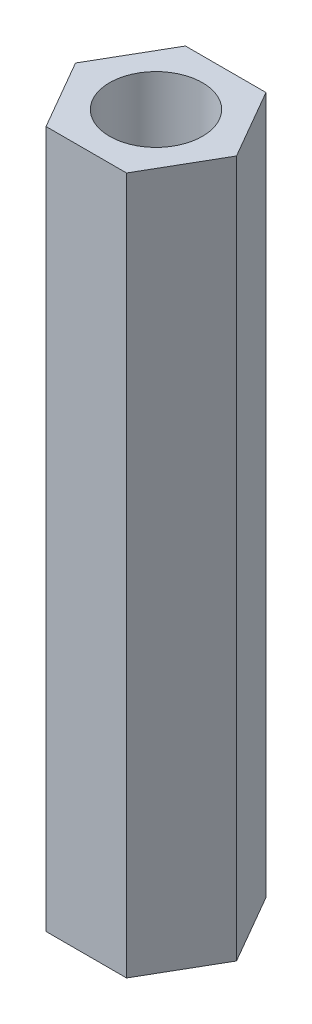
ISO-10303-21;
HEADER;
FILE_DESCRIPTION(('STEP AP214'),'2;1');
FILE_NAME('part.step','',(''),(''),'','','');
FILE_SCHEMA(('AUTOMOTIVE_DESIGN { 1 0 10303 214 1 1 1 1 }'));
ENDSEC;
DATA;
#1=APPLICATION_CONTEXT('core data for automotive mechanical design processes');
#2=APPLICATION_PROTOCOL_DEFINITION('international standard','automotive_design',2000,#1);
#3=PRODUCT_CONTEXT('',#1,'mechanical');
#4=PRODUCT('Part','Part','',(#3));
#5=PRODUCT_RELATED_PRODUCT_CATEGORY('part','',(#4));
#6=PRODUCT_DEFINITION_FORMATION('','',#4);
#7=PRODUCT_DEFINITION_CONTEXT('part definition',#1,'design');
#8=PRODUCT_DEFINITION('design','',#6,#7);
#9=PRODUCT_DEFINITION_SHAPE('','',#8);
#10=(LENGTH_UNIT() NAMED_UNIT(*) SI_UNIT(.MILLI.,.METRE.));
#11=(NAMED_UNIT(*) PLANE_ANGLE_UNIT() SI_UNIT($,.RADIAN.));
#12=(NAMED_UNIT(*) SI_UNIT($,.STERADIAN.) SOLID_ANGLE_UNIT());
#13=UNCERTAINTY_MEASURE_WITH_UNIT(LENGTH_MEASURE(1.E-05),#10,'distance_accuracy_value','');
#14=(GEOMETRIC_REPRESENTATION_CONTEXT(3) GLOBAL_UNCERTAINTY_ASSIGNED_CONTEXT((#13)) GLOBAL_UNIT_ASSIGNED_CONTEXT((#10,
#11,#12)) REPRESENTATION_CONTEXT('',''));
#15=CARTESIAN_POINT('',(0.,0.,0.));
#16=DIRECTION('',(0.,0.,1.));
#17=DIRECTION('',(1.,0.,0.));
#18=AXIS2_PLACEMENT_3D('',#15,#16,#17);
#19=CARTESIAN_POINT('',(0.,30.,0.));
#20=DIRECTION('',(0.,1.,0.));
#21=DIRECTION('',(0.,0.,1.));
#22=AXIS2_PLACEMENT_3D('',#19,#20,#21);
#23=PLANE('',#22);
#24=DIRECTION('',(0.5,0.,-0.866025403784439));
#25=VECTOR('',#24,1.);
#26=CARTESIAN_POINT('',(1.73205080756888,30.,3.));
#27=LINE('',#26,#25);
#28=CARTESIAN_POINT('',(1.73205080756888,30.,3.));
#29=VERTEX_POINT('',#28);
#30=CARTESIAN_POINT('',(3.46410161513775,30.,0.));
#31=VERTEX_POINT('',#30);
#32=EDGE_CURVE('E129',#29,#31,#27,.T.);
#33=ORIENTED_EDGE('',*,*,#32,.T.);
#34=DIRECTION('',(-0.5,0.,-0.866025403784439));
#35=VECTOR('',#34,1.);
#36=CARTESIAN_POINT('',(3.46410161513775,30.,0.));
#37=LINE('',#36,#35);
#38=CARTESIAN_POINT('',(1.73205080756887,30.,-3.));
#39=VERTEX_POINT('',#38);
#40=EDGE_CURVE('E87',#31,#39,#37,.T.);
#41=ORIENTED_EDGE('',*,*,#40,.T.);
#42=DIRECTION('',(-1.,0.,0.));
#43=VECTOR('',#42,1.);
#44=CARTESIAN_POINT('',(1.73205080756887,30.,-3.));
#45=LINE('',#44,#43);
#46=CARTESIAN_POINT('',(-1.73205080756888,30.,-3.));
#47=VERTEX_POINT('',#46);
#48=EDGE_CURVE('E100',#39,#47,#45,.T.);
#49=ORIENTED_EDGE('',*,*,#48,.T.);
#50=DIRECTION('',(-0.5,0.,0.866025403784439));
#51=VECTOR('',#50,1.);
#52=CARTESIAN_POINT('',(-1.73205080756888,30.,-3.));
#53=LINE('',#52,#51);
#54=CARTESIAN_POINT('',(-3.46410161513776,30.,0.));
#55=VERTEX_POINT('',#54);
#56=EDGE_CURVE('E94',#47,#55,#53,.T.);
#57=ORIENTED_EDGE('',*,*,#56,.T.);
#58=DIRECTION('',(0.5,0.,0.866025403784439));
#59=VECTOR('',#58,1.);
#60=CARTESIAN_POINT('',(-3.46410161513776,30.,0.));
#61=LINE('',#60,#59);
#62=CARTESIAN_POINT('',(-1.73205080756888,30.,3.));
#63=VERTEX_POINT('',#62);
#64=EDGE_CURVE('E98',#55,#63,#61,.T.);
#65=ORIENTED_EDGE('',*,*,#64,.T.);
#66=DIRECTION('',(1.,0.,0.));
#67=VECTOR('',#66,1.);
#68=CARTESIAN_POINT('',(-1.73205080756888,30.,3.));
#69=LINE('',#68,#67);
#70=EDGE_CURVE('E50',#63,#29,#69,.T.);
#71=ORIENTED_EDGE('',*,*,#70,.T.);
#72=EDGE_LOOP('',(#33,#41,#49,#57,#65,#71));
#73=FACE_BOUND('',#72,.T.);
#74=CARTESIAN_POINT('',(0.,30.,0.));
#75=DIRECTION('',(0.,1.,0.));
#76=DIRECTION('',(0.,0.,1.));
#77=AXIS2_PLACEMENT_3D('',#74,#75,#76);
#78=CIRCLE('',#77,2.);
#79=CARTESIAN_POINT('',(0.,30.,2.));
#80=VERTEX_POINT('',#79);
#81=EDGE_CURVE('E122',#80,#80,#78,.T.);
#82=ORIENTED_EDGE('',*,*,#81,.F.);
#83=EDGE_LOOP('',(#82));
#84=FACE_BOUND('',#83,.T.);
#85=ADVANCED_FACE('F33',(#73,#84),#23,.T.);
#86=CARTESIAN_POINT('',(0.,0.,0.));
#87=DIRECTION('',(0.,1.,0.));
#88=DIRECTION('',(0.,0.,1.));
#89=AXIS2_PLACEMENT_3D('',#86,#87,#88);
#90=PLANE('',#89);
#91=DIRECTION('',(0.5,0.,-0.866025403784439));
#92=VECTOR('',#91,1.);
#93=CARTESIAN_POINT('',(1.73205080756888,0.,3.));
#94=LINE('',#93,#92);
#95=CARTESIAN_POINT('',(1.73205080756888,0.,3.));
#96=VERTEX_POINT('',#95);
#97=CARTESIAN_POINT('',(3.46410161513775,0.,0.));
#98=VERTEX_POINT('',#97);
#99=EDGE_CURVE('E118',#96,#98,#94,.T.);
#100=ORIENTED_EDGE('',*,*,#99,.F.);
#101=DIRECTION('',(1.,0.,0.));
#102=VECTOR('',#101,1.);
#103=CARTESIAN_POINT('',(-1.73205080756888,0.,3.));
#104=LINE('',#103,#102);
#105=CARTESIAN_POINT('',(-1.73205080756888,0.,3.));
#106=VERTEX_POINT('',#105);
#107=EDGE_CURVE('E79',#106,#96,#104,.T.);
#108=ORIENTED_EDGE('',*,*,#107,.F.);
#109=DIRECTION('',(0.5,0.,0.866025403784439));
#110=VECTOR('',#109,1.);
#111=CARTESIAN_POINT('',(-3.46410161513776,0.,0.));
#112=LINE('',#111,#110);
#113=CARTESIAN_POINT('',(-3.46410161513776,0.,0.));
#114=VERTEX_POINT('',#113);
#115=EDGE_CURVE('E73',#114,#106,#112,.T.);
#116=ORIENTED_EDGE('',*,*,#115,.F.);
#117=DIRECTION('',(-0.5,0.,0.866025403784439));
#118=VECTOR('',#117,1.);
#119=CARTESIAN_POINT('',(-1.73205080756888,0.,-3.));
#120=LINE('',#119,#118);
#121=CARTESIAN_POINT('',(-1.73205080756888,0.,-3.));
#122=VERTEX_POINT('',#121);
#123=EDGE_CURVE('E108',#122,#114,#120,.T.);
#124=ORIENTED_EDGE('',*,*,#123,.F.);
#125=DIRECTION('',(-1.,0.,0.));
#126=VECTOR('',#125,1.);
#127=CARTESIAN_POINT('',(1.73205080756887,0.,-3.));
#128=LINE('',#127,#126);
#129=CARTESIAN_POINT('',(1.73205080756887,0.,-3.));
#130=VERTEX_POINT('',#129);
#131=EDGE_CURVE('E124',#130,#122,#128,.T.);
#132=ORIENTED_EDGE('',*,*,#131,.F.);
#133=DIRECTION('',(-0.5,0.,-0.866025403784439));
#134=VECTOR('',#133,1.);
#135=CARTESIAN_POINT('',(3.46410161513775,0.,0.));
#136=LINE('',#135,#134);
#137=EDGE_CURVE('E121',#98,#130,#136,.T.);
#138=ORIENTED_EDGE('',*,*,#137,.F.);
#139=EDGE_LOOP('',(#100,#108,#116,#124,#132,#138));
#140=FACE_BOUND('',#139,.T.);
#141=CARTESIAN_POINT('',(0.,0.,0.));
#142=DIRECTION('',(0.,1.,0.));
#143=DIRECTION('',(0.,0.,1.));
#144=AXIS2_PLACEMENT_3D('',#141,#142,#143);
#145=CIRCLE('',#144,2.);
#146=CARTESIAN_POINT('',(0.,0.,2.));
#147=VERTEX_POINT('',#146);
#148=EDGE_CURVE('E222',#147,#147,#145,.T.);
#149=ORIENTED_EDGE('',*,*,#148,.T.);
#150=EDGE_LOOP('',(#149));
#151=FACE_BOUND('',#150,.T.);
#152=ADVANCED_FACE('F138',(#140,#151),#90,.F.);
#153=CARTESIAN_POINT('',(1.73205080756888,30.,3.));
#154=DIRECTION('',(-0.866025403784439,0.,-0.5));
#155=DIRECTION('',(-0.5,0.,0.866025403784439));
#156=AXIS2_PLACEMENT_3D('',#153,#154,#155);
#157=PLANE('',#156);
#158=ORIENTED_EDGE('',*,*,#99,.T.);
#159=DIRECTION('',(0.,-1.,0.));
#160=VECTOR('',#159,1.);
#161=CARTESIAN_POINT('',(3.46410161513775,30.,0.));
#162=LINE('',#161,#160);
#163=EDGE_CURVE('E11',#31,#98,#162,.T.);
#164=ORIENTED_EDGE('',*,*,#163,.F.);
#165=ORIENTED_EDGE('',*,*,#32,.F.);
#166=DIRECTION('',(0.,-1.,0.));
#167=VECTOR('',#166,1.);
#168=CARTESIAN_POINT('',(1.73205080756888,30.,3.));
#169=LINE('',#168,#167);
#170=EDGE_CURVE('E114',#29,#96,#169,.T.);
#171=ORIENTED_EDGE('',*,*,#170,.T.);
#172=EDGE_LOOP('',(#158,#164,#165,#171));
#173=FACE_BOUND('',#172,.T.);
#174=ADVANCED_FACE('F35',(#173),#157,.F.);
#175=CARTESIAN_POINT('',(3.46410161513775,30.,0.));
#176=DIRECTION('',(-0.866025403784439,0.,0.5));
#177=DIRECTION('',(0.5,0.,0.866025403784439));
#178=AXIS2_PLACEMENT_3D('',#175,#176,#177);
#179=PLANE('',#178);
#180=ORIENTED_EDGE('',*,*,#137,.T.);
#181=DIRECTION('',(0.,-1.,0.));
#182=VECTOR('',#181,1.);
#183=CARTESIAN_POINT('',(1.73205080756887,30.,-3.));
#184=LINE('',#183,#182);
#185=EDGE_CURVE('E42',#39,#130,#184,.T.);
#186=ORIENTED_EDGE('',*,*,#185,.F.);
#187=ORIENTED_EDGE('',*,*,#40,.F.);
#188=ORIENTED_EDGE('',*,*,#163,.T.);
#189=EDGE_LOOP('',(#180,#186,#187,#188));
#190=FACE_BOUND('',#189,.T.);
#191=ADVANCED_FACE('F163',(#190),#179,.F.);
#192=CARTESIAN_POINT('',(1.73205080756887,30.,-3.));
#193=DIRECTION('',(0.,0.,1.));
#194=DIRECTION('',(1.,0.,0.));
#195=AXIS2_PLACEMENT_3D('',#192,#193,#194);
#196=PLANE('',#195);
#197=ORIENTED_EDGE('',*,*,#131,.T.);
#198=DIRECTION('',(0.,-1.,0.));
#199=VECTOR('',#198,1.);
#200=CARTESIAN_POINT('',(-1.73205080756888,30.,-3.));
#201=LINE('',#200,#199);
#202=EDGE_CURVE('E109',#47,#122,#201,.T.);
#203=ORIENTED_EDGE('',*,*,#202,.F.);
#204=ORIENTED_EDGE('',*,*,#48,.F.);
#205=ORIENTED_EDGE('',*,*,#185,.T.);
#206=EDGE_LOOP('',(#197,#203,#204,#205));
#207=FACE_BOUND('',#206,.T.);
#208=ADVANCED_FACE('F135',(#207),#196,.F.);
#209=CARTESIAN_POINT('',(-1.73205080756888,30.,-3.));
#210=DIRECTION('',(0.866025403784439,0.,0.5));
#211=DIRECTION('',(0.5,0.,-0.866025403784439));
#212=AXIS2_PLACEMENT_3D('',#209,#210,#211);
#213=PLANE('',#212);
#214=ORIENTED_EDGE('',*,*,#123,.T.);
#215=DIRECTION('',(0.,-1.,0.));
#216=VECTOR('',#215,1.);
#217=CARTESIAN_POINT('',(-3.46410161513776,30.,0.));
#218=LINE('',#217,#216);
#219=EDGE_CURVE('E105',#55,#114,#218,.T.);
#220=ORIENTED_EDGE('',*,*,#219,.F.);
#221=ORIENTED_EDGE('',*,*,#56,.F.);
#222=ORIENTED_EDGE('',*,*,#202,.T.);
#223=EDGE_LOOP('',(#214,#220,#221,#222));
#224=FACE_BOUND('',#223,.T.);
#225=ADVANCED_FACE('F106',(#224),#213,.F.);
#226=CARTESIAN_POINT('',(-3.46410161513776,30.,0.));
#227=DIRECTION('',(0.866025403784439,0.,-0.5));
#228=DIRECTION('',(-0.5,0.,-0.866025403784439));
#229=AXIS2_PLACEMENT_3D('',#226,#227,#228);
#230=PLANE('',#229);
#231=ORIENTED_EDGE('',*,*,#115,.T.);
#232=DIRECTION('',(0.,-1.,0.));
#233=VECTOR('',#232,1.);
#234=CARTESIAN_POINT('',(-1.73205080756888,30.,3.));
#235=LINE('',#234,#233);
#236=EDGE_CURVE('E110',#63,#106,#235,.T.);
#237=ORIENTED_EDGE('',*,*,#236,.F.);
#238=ORIENTED_EDGE('',*,*,#64,.F.);
#239=ORIENTED_EDGE('',*,*,#219,.T.);
#240=EDGE_LOOP('',(#231,#237,#238,#239));
#241=FACE_BOUND('',#240,.T.);
#242=ADVANCED_FACE('F112',(#241),#230,.F.);
#243=CARTESIAN_POINT('',(-1.73205080756888,30.,3.));
#244=DIRECTION('',(0.,0.,-1.));
#245=DIRECTION('',(-1.,0.,0.));
#246=AXIS2_PLACEMENT_3D('',#243,#244,#245);
#247=PLANE('',#246);
#248=ORIENTED_EDGE('',*,*,#107,.T.);
#249=ORIENTED_EDGE('',*,*,#170,.F.);
#250=ORIENTED_EDGE('',*,*,#70,.F.);
#251=ORIENTED_EDGE('',*,*,#236,.T.);
#252=EDGE_LOOP('',(#248,#249,#250,#251));
#253=FACE_BOUND('',#252,.T.);
#254=ADVANCED_FACE('F143',(#253),#247,.F.);
#255=CARTESIAN_POINT('',(0.,30.,0.));
#256=DIRECTION('',(0.,-1.,0.));
#257=DIRECTION('',(0.,0.,-1.));
#258=AXIS2_PLACEMENT_3D('',#255,#256,#257);
#259=CYLINDRICAL_SURFACE('',#258,2.);
#260=ORIENTED_EDGE('',*,*,#81,.T.);
#261=EDGE_LOOP('',(#260));
#262=FACE_BOUND('',#261,.T.);
#263=ORIENTED_EDGE('',*,*,#148,.F.);
#264=EDGE_LOOP('',(#263));
#265=FACE_BOUND('',#264,.T.);
#266=ADVANCED_FACE('F145',(#262,#265),#259,.F.);
#267=CLOSED_SHELL('',(#85,#152,#174,#191,#208,#225,#242,#254,#266));
#268=MANIFOLD_SOLID_BREP('B2',#267);
#269=ADVANCED_BREP_SHAPE_REPRESENTATION('',(#18,#268),#14);
#270=SHAPE_DEFINITION_REPRESENTATION(#9,#269);
ENDSEC;
END-ISO-10303-21;
